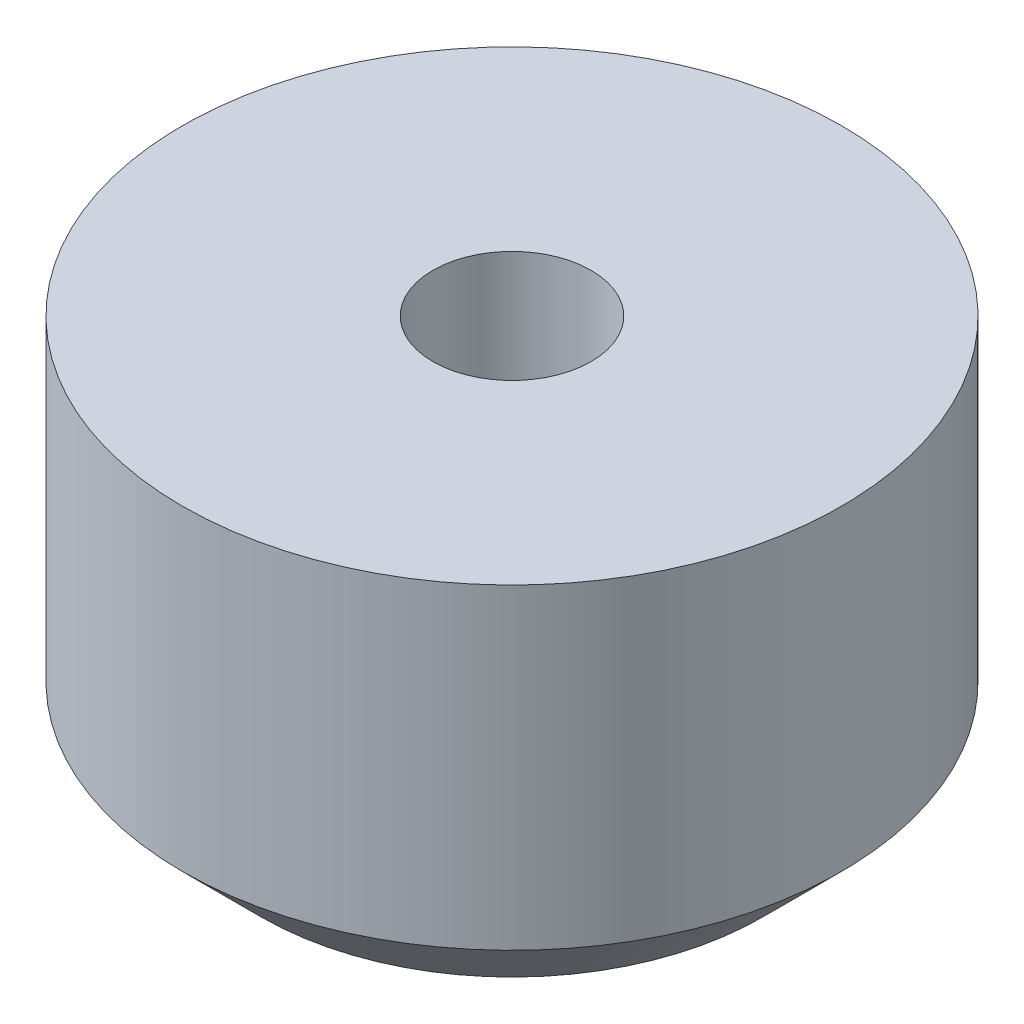
ISO-10303-21;
HEADER;
FILE_DESCRIPTION(('STEP AP214'),'2;1');
FILE_NAME('part.step','',(''),(''),'','','');
FILE_SCHEMA(('AUTOMOTIVE_DESIGN { 1 0 10303 214 1 1 1 1 }'));
ENDSEC;
DATA;
#1=APPLICATION_CONTEXT('core data for automotive mechanical design processes');
#2=APPLICATION_PROTOCOL_DEFINITION('international standard','automotive_design',2000,#1);
#3=PRODUCT_CONTEXT('',#1,'mechanical');
#4=PRODUCT('Part','Part','',(#3));
#5=PRODUCT_RELATED_PRODUCT_CATEGORY('part','',(#4));
#6=PRODUCT_DEFINITION_FORMATION('','',#4);
#7=PRODUCT_DEFINITION_CONTEXT('part definition',#1,'design');
#8=PRODUCT_DEFINITION('design','',#6,#7);
#9=PRODUCT_DEFINITION_SHAPE('','',#8);
#10=(LENGTH_UNIT() NAMED_UNIT(*) SI_UNIT(.MILLI.,.METRE.));
#11=(NAMED_UNIT(*) PLANE_ANGLE_UNIT() SI_UNIT($,.RADIAN.));
#12=(NAMED_UNIT(*) SI_UNIT($,.STERADIAN.) SOLID_ANGLE_UNIT());
#13=UNCERTAINTY_MEASURE_WITH_UNIT(LENGTH_MEASURE(1.E-05),#10,'distance_accuracy_value','');
#14=(GEOMETRIC_REPRESENTATION_CONTEXT(3) GLOBAL_UNCERTAINTY_ASSIGNED_CONTEXT((#13)) GLOBAL_UNIT_ASSIGNED_CONTEXT((#10,
#11,#12)) REPRESENTATION_CONTEXT('',''));
#15=CARTESIAN_POINT('',(0.,0.,0.));
#16=DIRECTION('',(0.,0.,1.));
#17=DIRECTION('',(1.,0.,0.));
#18=AXIS2_PLACEMENT_3D('',#15,#16,#17);
#19=CARTESIAN_POINT('',(0.,15.,0.));
#20=DIRECTION('',(0.,-1.,0.));
#21=DIRECTION('',(0.,0.,-1.));
#22=AXIS2_PLACEMENT_3D('',#19,#20,#21);
#23=CYLINDRICAL_SURFACE('',#22,3.);
#24=CARTESIAN_POINT('',(0.,15.,0.));
#25=DIRECTION('',(0.,1.,0.));
#26=DIRECTION('',(0.,0.,1.));
#27=AXIS2_PLACEMENT_3D('',#24,#25,#26);
#28=CIRCLE('',#27,3.);
#29=CARTESIAN_POINT('',(0.,15.,3.));
#30=VERTEX_POINT('',#29);
#31=EDGE_CURVE('E49',#30,#30,#28,.T.);
#32=ORIENTED_EDGE('',*,*,#31,.T.);
#33=EDGE_LOOP('',(#32));
#34=FACE_BOUND('',#33,.T.);
#35=CARTESIAN_POINT('',(0.,5.,0.));
#36=DIRECTION('',(0.,-1.,0.));
#37=DIRECTION('',(0.,0.,-1.));
#38=AXIS2_PLACEMENT_3D('',#35,#36,#37);
#39=CIRCLE('',#38,3.);
#40=CARTESIAN_POINT('',(0.,5.,-3.));
#41=VERTEX_POINT('',#40);
#42=EDGE_CURVE('E36',#41,#41,#39,.T.);
#43=ORIENTED_EDGE('',*,*,#42,.T.);
#44=EDGE_LOOP('',(#43));
#45=FACE_BOUND('',#44,.T.);
#46=ADVANCED_FACE('F32',(#34,#45),#23,.F.);
#47=CARTESIAN_POINT('',(0.,15.,0.));
#48=DIRECTION('',(0.,1.,0.));
#49=DIRECTION('',(0.,0.,1.));
#50=AXIS2_PLACEMENT_3D('',#47,#48,#49);
#51=PLANE('',#50);
#52=CARTESIAN_POINT('',(0.,15.,0.));
#53=DIRECTION('',(0.,1.,0.));
#54=DIRECTION('',(0.,0.,1.));
#55=AXIS2_PLACEMENT_3D('',#52,#53,#54);
#56=CIRCLE('',#55,12.5);
#57=CARTESIAN_POINT('',(0.,15.,12.5));
#58=VERTEX_POINT('',#57);
#59=EDGE_CURVE('E44',#58,#58,#56,.T.);
#60=ORIENTED_EDGE('',*,*,#59,.T.);
#61=EDGE_LOOP('',(#60));
#62=FACE_BOUND('',#61,.T.);
#63=ORIENTED_EDGE('',*,*,#31,.F.);
#64=EDGE_LOOP('',(#63));
#65=FACE_BOUND('',#64,.T.);
#66=ADVANCED_FACE('F73',(#62,#65),#51,.T.);
#67=CARTESIAN_POINT('',(0.,0.,0.));
#68=DIRECTION('',(0.,1.,0.));
#69=DIRECTION('',(0.,0.,1.));
#70=AXIS2_PLACEMENT_3D('',#67,#68,#69);
#71=PLANE('',#70);
#72=CARTESIAN_POINT('',(0.,0.,0.));
#73=DIRECTION('',(0.,-1.,0.));
#74=DIRECTION('',(0.,0.,-1.));
#75=AXIS2_PLACEMENT_3D('',#72,#73,#74);
#76=CIRCLE('',#75,6.);
#77=CARTESIAN_POINT('',(0.,0.,-6.));
#78=VERTEX_POINT('',#77);
#79=EDGE_CURVE('E52',#78,#78,#76,.T.);
#80=ORIENTED_EDGE('',*,*,#79,.F.);
#81=EDGE_LOOP('',(#80));
#82=FACE_BOUND('',#81,.T.);
#83=CARTESIAN_POINT('',(0.,0.,0.));
#84=DIRECTION('',(0.,1.,0.));
#85=DIRECTION('',(0.,0.,1.));
#86=AXIS2_PLACEMENT_3D('',#83,#84,#85);
#87=CIRCLE('',#86,9.49999999999999);
#88=CARTESIAN_POINT('',(0.,0.,9.49999999999999));
#89=VERTEX_POINT('',#88);
#90=EDGE_CURVE('E10',#89,#89,#87,.F.);
#91=ORIENTED_EDGE('',*,*,#90,.T.);
#92=EDGE_LOOP('',(#91));
#93=FACE_BOUND('',#92,.T.);
#94=ADVANCED_FACE('F79',(#82,#93),#71,.F.);
#95=CARTESIAN_POINT('',(0.,15.,0.));
#96=DIRECTION('',(0.,-1.,0.));
#97=DIRECTION('',(0.,0.,-1.));
#98=AXIS2_PLACEMENT_3D('',#95,#96,#97);
#99=CYLINDRICAL_SURFACE('',#98,12.5);
#100=CARTESIAN_POINT('',(0.,3.,0.));
#101=DIRECTION('',(0.,1.,0.));
#102=DIRECTION('',(0.,0.,1.));
#103=AXIS2_PLACEMENT_3D('',#100,#101,#102);
#104=CIRCLE('',#103,12.5);
#105=CARTESIAN_POINT('',(0.,3.,12.5));
#106=VERTEX_POINT('',#105);
#107=EDGE_CURVE('E40',#106,#106,#104,.T.);
#108=ORIENTED_EDGE('',*,*,#107,.T.);
#109=EDGE_LOOP('',(#108));
#110=FACE_BOUND('',#109,.T.);
#111=ORIENTED_EDGE('',*,*,#59,.F.);
#112=EDGE_LOOP('',(#111));
#113=FACE_BOUND('',#112,.T.);
#114=ADVANCED_FACE('F84',(#110,#113),#99,.T.);
#115=CARTESIAN_POINT('',(0.,3.,0.));
#116=DIRECTION('',(0.,1.,0.));
#117=DIRECTION('',(0.,0.,1.));
#118=AXIS2_PLACEMENT_3D('',#115,#116,#117);
#119=CONICAL_SURFACE('',#118,12.5,0.78539816339745);
#120=ORIENTED_EDGE('',*,*,#90,.F.);
#121=EDGE_LOOP('',(#120));
#122=FACE_BOUND('',#121,.T.);
#123=ORIENTED_EDGE('',*,*,#107,.F.);
#124=EDGE_LOOP('',(#123));
#125=FACE_BOUND('',#124,.T.);
#126=ADVANCED_FACE('F34',(#122,#125),#119,.T.);
#127=CARTESIAN_POINT('',(0.,5.,0.));
#128=DIRECTION('',(0.,-1.,0.));
#129=DIRECTION('',(0.,0.,-1.));
#130=AXIS2_PLACEMENT_3D('',#127,#128,#129);
#131=CYLINDRICAL_SURFACE('',#130,6.);
#132=CARTESIAN_POINT('',(0.,5.,0.));
#133=DIRECTION('',(0.,-1.,0.));
#134=DIRECTION('',(0.,0.,-1.));
#135=AXIS2_PLACEMENT_3D('',#132,#133,#134);
#136=CIRCLE('',#135,6.);
#137=CARTESIAN_POINT('',(0.,5.,-6.));
#138=VERTEX_POINT('',#137);
#139=EDGE_CURVE('E55',#138,#138,#136,.T.);
#140=ORIENTED_EDGE('',*,*,#139,.F.);
#141=EDGE_LOOP('',(#140));
#142=FACE_BOUND('',#141,.T.);
#143=ORIENTED_EDGE('',*,*,#79,.T.);
#144=EDGE_LOOP('',(#143));
#145=FACE_BOUND('',#144,.T.);
#146=ADVANCED_FACE('F65',(#142,#145),#131,.F.);
#147=CARTESIAN_POINT('',(0.,5.,0.));
#148=DIRECTION('',(0.,-1.,0.));
#149=DIRECTION('',(0.,0.,-1.));
#150=AXIS2_PLACEMENT_3D('',#147,#148,#149);
#151=PLANE('',#150);
#152=ORIENTED_EDGE('',*,*,#42,.F.);
#153=EDGE_LOOP('',(#152));
#154=FACE_BOUND('',#153,.T.);
#155=ORIENTED_EDGE('',*,*,#139,.T.);
#156=EDGE_LOOP('',(#155));
#157=FACE_BOUND('',#156,.T.);
#158=ADVANCED_FACE('F63',(#154,#157),#151,.T.);
#159=CLOSED_SHELL('',(#46,#66,#94,#114,#126,#146,#158));
#160=MANIFOLD_SOLID_BREP('B2',#159);
#161=ADVANCED_BREP_SHAPE_REPRESENTATION('',(#18,#160),#14);
#162=SHAPE_DEFINITION_REPRESENTATION(#9,#161);
ENDSEC;
END-ISO-10303-21;
